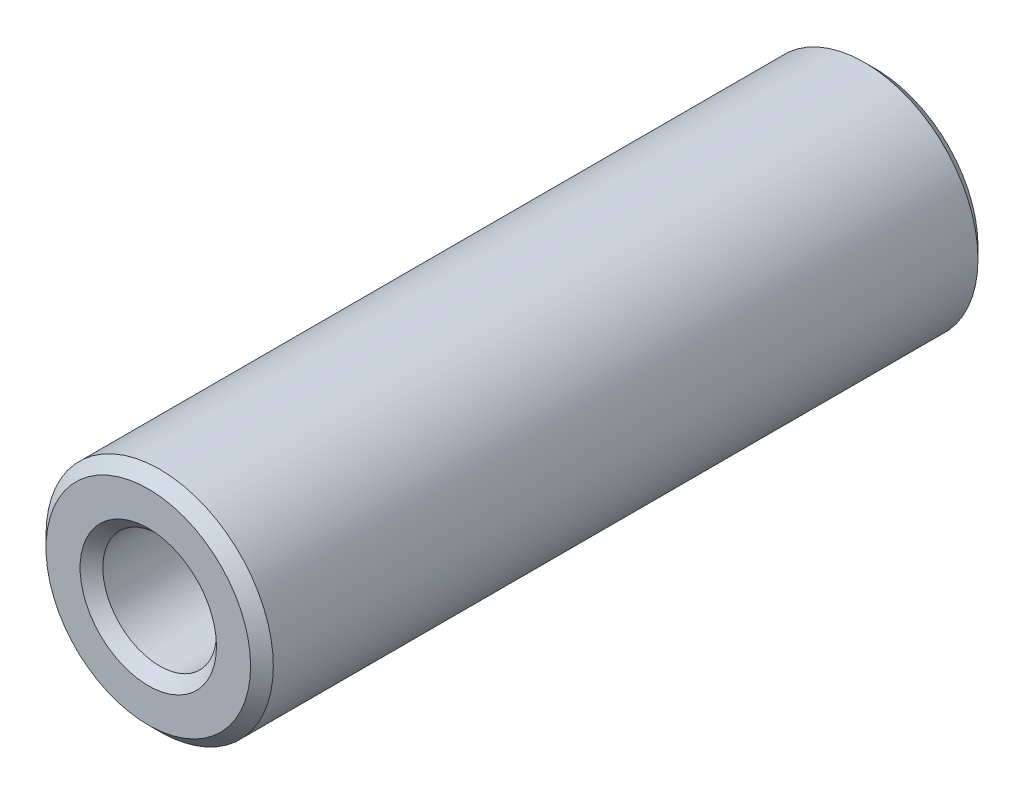
ISO-10303-21;
HEADER;
FILE_DESCRIPTION(('STEP AP214'),'2;1');
FILE_NAME('part.step','',(''),(''),'','','');
FILE_SCHEMA(('AUTOMOTIVE_DESIGN { 1 0 10303 214 1 1 1 1 }'));
ENDSEC;
DATA;
#1=APPLICATION_CONTEXT('core data for automotive mechanical design processes');
#2=APPLICATION_PROTOCOL_DEFINITION('international standard','automotive_design',2000,#1);
#3=PRODUCT_CONTEXT('',#1,'mechanical');
#4=PRODUCT('Part','Part','',(#3));
#5=PRODUCT_RELATED_PRODUCT_CATEGORY('part','',(#4));
#6=PRODUCT_DEFINITION_FORMATION('','',#4);
#7=PRODUCT_DEFINITION_CONTEXT('part definition',#1,'design');
#8=PRODUCT_DEFINITION('design','',#6,#7);
#9=PRODUCT_DEFINITION_SHAPE('','',#8);
#10=(LENGTH_UNIT() NAMED_UNIT(*) SI_UNIT(.MILLI.,.METRE.));
#11=(NAMED_UNIT(*) PLANE_ANGLE_UNIT() SI_UNIT($,.RADIAN.));
#12=(NAMED_UNIT(*) SI_UNIT($,.STERADIAN.) SOLID_ANGLE_UNIT());
#13=UNCERTAINTY_MEASURE_WITH_UNIT(LENGTH_MEASURE(1.E-05),#10,'distance_accuracy_value','');
#14=(GEOMETRIC_REPRESENTATION_CONTEXT(3) GLOBAL_UNCERTAINTY_ASSIGNED_CONTEXT((#13)) GLOBAL_UNIT_ASSIGNED_CONTEXT((#10,
#11,#12)) REPRESENTATION_CONTEXT('',''));
#15=CARTESIAN_POINT('',(0.,0.,0.));
#16=DIRECTION('',(0.,0.,1.));
#17=DIRECTION('',(1.,0.,0.));
#18=AXIS2_PLACEMENT_3D('',#15,#16,#17);
#19=CARTESIAN_POINT('',(0.,0.,16.));
#20=DIRECTION('',(0.,0.,1.));
#21=DIRECTION('',(1.,0.,0.));
#22=AXIS2_PLACEMENT_3D('',#19,#20,#21);
#23=PLANE('',#22);
#24=CARTESIAN_POINT('',(0.,0.,16.));
#25=DIRECTION('',(0.,0.,1.));
#26=DIRECTION('',(1.,0.,0.));
#27=AXIS2_PLACEMENT_3D('',#24,#25,#26);
#28=CIRCLE('',#27,3.00000000000001);
#29=CARTESIAN_POINT('',(3.00000000000001,0.,16.));
#30=VERTEX_POINT('',#29);
#31=EDGE_CURVE('E52',#30,#30,#28,.F.);
#32=ORIENTED_EDGE('',*,*,#31,.T.);
#33=EDGE_LOOP('',(#32));
#34=FACE_BOUND('',#33,.T.);
#35=CARTESIAN_POINT('',(0.,0.,16.));
#36=DIRECTION('',(0.,0.,1.));
#37=DIRECTION('',(1.,0.,0.));
#38=AXIS2_PLACEMENT_3D('',#35,#36,#37);
#39=CIRCLE('',#38,4.5);
#40=CARTESIAN_POINT('',(4.5,0.,16.));
#41=VERTEX_POINT('',#40);
#42=EDGE_CURVE('E60',#41,#41,#39,.T.);
#43=ORIENTED_EDGE('',*,*,#42,.T.);
#44=EDGE_LOOP('',(#43));
#45=FACE_BOUND('',#44,.T.);
#46=ADVANCED_FACE('F41',(#34,#45),#23,.T.);
#47=CARTESIAN_POINT('',(0.,0.,-16.));
#48=DIRECTION('',(0.,0.,1.));
#49=DIRECTION('',(1.,0.,0.));
#50=AXIS2_PLACEMENT_3D('',#47,#48,#49);
#51=PLANE('',#50);
#52=CARTESIAN_POINT('',(0.,0.,-16.));
#53=DIRECTION('',(0.,0.,1.));
#54=DIRECTION('',(1.,0.,0.));
#55=AXIS2_PLACEMENT_3D('',#52,#53,#54);
#56=CIRCLE('',#55,3.);
#57=CARTESIAN_POINT('',(3.,0.,-16.));
#58=VERTEX_POINT('',#57);
#59=EDGE_CURVE('E69',#58,#58,#56,.T.);
#60=ORIENTED_EDGE('',*,*,#59,.T.);
#61=EDGE_LOOP('',(#60));
#62=FACE_BOUND('',#61,.T.);
#63=CARTESIAN_POINT('',(0.,0.,-16.));
#64=DIRECTION('',(0.,0.,1.));
#65=DIRECTION('',(1.,0.,0.));
#66=AXIS2_PLACEMENT_3D('',#63,#64,#65);
#67=CIRCLE('',#66,4.49999999999999);
#68=CARTESIAN_POINT('',(4.49999999999999,0.,-16.));
#69=VERTEX_POINT('',#68);
#70=EDGE_CURVE('E72',#69,#69,#67,.F.);
#71=ORIENTED_EDGE('',*,*,#70,.T.);
#72=EDGE_LOOP('',(#71));
#73=FACE_BOUND('',#72,.T.);
#74=ADVANCED_FACE('F73',(#62,#73),#51,.F.);
#75=CARTESIAN_POINT('',(0.,0.,16.));
#76=DIRECTION('',(0.,0.,-1.));
#77=DIRECTION('',(-1.,0.,0.));
#78=AXIS2_PLACEMENT_3D('',#75,#76,#77);
#79=CYLINDRICAL_SURFACE('',#78,5.);
#80=CARTESIAN_POINT('',(0.,0.,-15.5));
#81=DIRECTION('',(0.,0.,1.));
#82=DIRECTION('',(1.,0.,0.));
#83=AXIS2_PLACEMENT_3D('',#80,#81,#82);
#84=CIRCLE('',#83,5.);
#85=CARTESIAN_POINT('',(5.,0.,-15.5));
#86=VERTEX_POINT('',#85);
#87=EDGE_CURVE('E10',#86,#86,#84,.T.);
#88=ORIENTED_EDGE('',*,*,#87,.T.);
#89=EDGE_LOOP('',(#88));
#90=FACE_BOUND('',#89,.T.);
#91=CARTESIAN_POINT('',(0.,0.,15.5));
#92=DIRECTION('',(0.,0.,1.));
#93=DIRECTION('',(1.,0.,0.));
#94=AXIS2_PLACEMENT_3D('',#91,#92,#93);
#95=CIRCLE('',#94,5.);
#96=CARTESIAN_POINT('',(5.,0.,15.5));
#97=VERTEX_POINT('',#96);
#98=EDGE_CURVE('E47',#97,#97,#95,.F.);
#99=ORIENTED_EDGE('',*,*,#98,.T.);
#100=EDGE_LOOP('',(#99));
#101=FACE_BOUND('',#100,.T.);
#102=ADVANCED_FACE('F96',(#90,#101),#79,.T.);
#103=CARTESIAN_POINT('',(0.,0.,16.));
#104=DIRECTION('',(0.,0.,-1.));
#105=DIRECTION('',(-1.,0.,0.));
#106=AXIS2_PLACEMENT_3D('',#103,#104,#105);
#107=CYLINDRICAL_SURFACE('',#106,2.5);
#108=CARTESIAN_POINT('',(0.,0.,-15.5));
#109=DIRECTION('',(0.,0.,1.));
#110=DIRECTION('',(1.,0.,0.));
#111=AXIS2_PLACEMENT_3D('',#108,#109,#110);
#112=CIRCLE('',#111,2.5);
#113=CARTESIAN_POINT('',(2.5,0.,-15.5));
#114=VERTEX_POINT('',#113);
#115=EDGE_CURVE('E65',#114,#114,#112,.F.);
#116=ORIENTED_EDGE('',*,*,#115,.T.);
#117=EDGE_LOOP('',(#116));
#118=FACE_BOUND('',#117,.T.);
#119=CARTESIAN_POINT('',(0.,0.,15.5));
#120=DIRECTION('',(0.,0.,1.));
#121=DIRECTION('',(1.,0.,0.));
#122=AXIS2_PLACEMENT_3D('',#119,#120,#121);
#123=CIRCLE('',#122,2.5);
#124=CARTESIAN_POINT('',(2.5,0.,15.5));
#125=VERTEX_POINT('',#124);
#126=EDGE_CURVE('E64',#125,#125,#123,.T.);
#127=ORIENTED_EDGE('',*,*,#126,.T.);
#128=EDGE_LOOP('',(#127));
#129=FACE_BOUND('',#128,.T.);
#130=ADVANCED_FACE('F101',(#118,#129),#107,.F.);
#131=CARTESIAN_POINT('',(0.,0.,-16.));
#132=DIRECTION('',(0.,0.,-1.));
#133=DIRECTION('',(-1.,0.,0.));
#134=AXIS2_PLACEMENT_3D('',#131,#132,#133);
#135=CONICAL_SURFACE('',#134,3.,0.785398163397447);
#136=ORIENTED_EDGE('',*,*,#115,.F.);
#137=EDGE_LOOP('',(#136));
#138=FACE_BOUND('',#137,.T.);
#139=ORIENTED_EDGE('',*,*,#59,.F.);
#140=EDGE_LOOP('',(#139));
#141=FACE_BOUND('',#140,.T.);
#142=ADVANCED_FACE('F88',(#138,#141),#135,.F.);
#143=CARTESIAN_POINT('',(0.,0.,15.5));
#144=DIRECTION('',(0.,0.,1.));
#145=DIRECTION('',(1.,0.,0.));
#146=AXIS2_PLACEMENT_3D('',#143,#144,#145);
#147=CONICAL_SURFACE('',#146,2.5,0.785398163397454);
#148=ORIENTED_EDGE('',*,*,#31,.F.);
#149=EDGE_LOOP('',(#148));
#150=FACE_BOUND('',#149,.T.);
#151=ORIENTED_EDGE('',*,*,#126,.F.);
#152=EDGE_LOOP('',(#151));
#153=FACE_BOUND('',#152,.T.);
#154=ADVANCED_FACE('F79',(#150,#153),#147,.F.);
#155=CARTESIAN_POINT('',(0.,0.,-15.5));
#156=DIRECTION('',(0.,0.,1.));
#157=DIRECTION('',(1.,0.,0.));
#158=AXIS2_PLACEMENT_3D('',#155,#156,#157);
#159=CONICAL_SURFACE('',#158,5.,0.785398163397454);
#160=ORIENTED_EDGE('',*,*,#70,.F.);
#161=EDGE_LOOP('',(#160));
#162=FACE_BOUND('',#161,.T.);
#163=ORIENTED_EDGE('',*,*,#87,.F.);
#164=EDGE_LOOP('',(#163));
#165=FACE_BOUND('',#164,.T.);
#166=ADVANCED_FACE('F80',(#162,#165),#159,.T.);
#167=CARTESIAN_POINT('',(0.,0.,16.));
#168=DIRECTION('',(0.,0.,-1.));
#169=DIRECTION('',(-1.,0.,0.));
#170=AXIS2_PLACEMENT_3D('',#167,#168,#169);
#171=CONICAL_SURFACE('',#170,4.5,0.785398163397447);
#172=ORIENTED_EDGE('',*,*,#98,.F.);
#173=EDGE_LOOP('',(#172));
#174=FACE_BOUND('',#173,.T.);
#175=ORIENTED_EDGE('',*,*,#42,.F.);
#176=EDGE_LOOP('',(#175));
#177=FACE_BOUND('',#176,.T.);
#178=ADVANCED_FACE('F42',(#174,#177),#171,.T.);
#179=CLOSED_SHELL('',(#46,#74,#102,#130,#142,#154,#166,#178));
#180=MANIFOLD_SOLID_BREP('B2',#179);
#181=ADVANCED_BREP_SHAPE_REPRESENTATION('',(#18,#180),#14);
#182=SHAPE_DEFINITION_REPRESENTATION(#9,#181);
ENDSEC;
END-ISO-10303-21;
